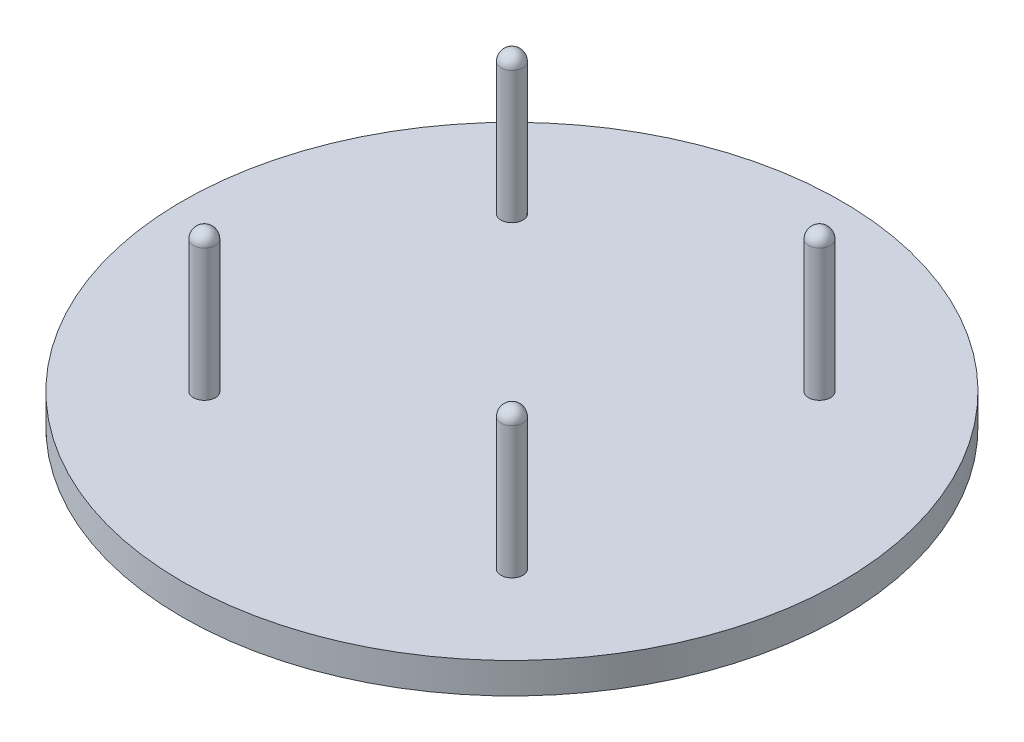
ISO-10303-21;
HEADER;
FILE_DESCRIPTION(('STEP AP214'),'2;1');
FILE_NAME('part.step','',(''),(''),'','','');
FILE_SCHEMA(('AUTOMOTIVE_DESIGN { 1 0 10303 214 1 1 1 1 }'));
ENDSEC;
DATA;
#1=APPLICATION_CONTEXT('core data for automotive mechanical design processes');
#2=APPLICATION_PROTOCOL_DEFINITION('international standard','automotive_design',2000,#1);
#3=PRODUCT_CONTEXT('',#1,'mechanical');
#4=PRODUCT('Part','Part','',(#3));
#5=PRODUCT_RELATED_PRODUCT_CATEGORY('part','',(#4));
#6=PRODUCT_DEFINITION_FORMATION('','',#4);
#7=PRODUCT_DEFINITION_CONTEXT('part definition',#1,'design');
#8=PRODUCT_DEFINITION('design','',#6,#7);
#9=PRODUCT_DEFINITION_SHAPE('','',#8);
#10=(LENGTH_UNIT() NAMED_UNIT(*) SI_UNIT(.MILLI.,.METRE.));
#11=(NAMED_UNIT(*) PLANE_ANGLE_UNIT() SI_UNIT($,.RADIAN.));
#12=(NAMED_UNIT(*) SI_UNIT($,.STERADIAN.) SOLID_ANGLE_UNIT());
#13=UNCERTAINTY_MEASURE_WITH_UNIT(LENGTH_MEASURE(1.E-05),#10,'distance_accuracy_value','');
#14=(GEOMETRIC_REPRESENTATION_CONTEXT(3) GLOBAL_UNCERTAINTY_ASSIGNED_CONTEXT((#13)) GLOBAL_UNIT_ASSIGNED_CONTEXT((#10,
#11,#12)) REPRESENTATION_CONTEXT('',''));
#15=CARTESIAN_POINT('',(0.,0.,0.));
#16=DIRECTION('',(0.,0.,1.));
#17=DIRECTION('',(1.,0.,0.));
#18=AXIS2_PLACEMENT_3D('',#15,#16,#17);
#19=CARTESIAN_POINT('',(0.,7.,0.));
#20=DIRECTION('',(0.,-1.,0.));
#21=DIRECTION('',(0.,0.,-1.));
#22=AXIS2_PLACEMENT_3D('',#19,#20,#21);
#23=CYLINDRICAL_SURFACE('',#22,75.);
#24=CARTESIAN_POINT('',(0.,7.,0.));
#25=DIRECTION('',(0.,1.,0.));
#26=DIRECTION('',(0.,0.,1.));
#27=AXIS2_PLACEMENT_3D('',#24,#25,#26);
#28=CIRCLE('',#27,75.);
#29=CARTESIAN_POINT('',(0.,7.,75.));
#30=VERTEX_POINT('',#29);
#31=EDGE_CURVE('E10',#30,#30,#28,.T.);
#32=ORIENTED_EDGE('',*,*,#31,.F.);
#33=EDGE_LOOP('',(#32));
#34=FACE_BOUND('',#33,.T.);
#35=CARTESIAN_POINT('',(0.,0.,0.));
#36=DIRECTION('',(0.,1.,0.));
#37=DIRECTION('',(0.,0.,1.));
#38=AXIS2_PLACEMENT_3D('',#35,#36,#37);
#39=CIRCLE('',#38,75.);
#40=CARTESIAN_POINT('',(0.,0.,75.));
#41=VERTEX_POINT('',#40);
#42=EDGE_CURVE('E52',#41,#41,#39,.T.);
#43=ORIENTED_EDGE('',*,*,#42,.T.);
#44=EDGE_LOOP('',(#43));
#45=FACE_BOUND('',#44,.T.);
#46=ADVANCED_FACE('F43',(#34,#45),#23,.T.);
#47=CARTESIAN_POINT('',(0.,7.,0.));
#48=DIRECTION('',(0.,1.,0.));
#49=DIRECTION('',(0.,0.,1.));
#50=AXIS2_PLACEMENT_3D('',#47,#48,#49);
#51=PLANE('',#50);
#52=CARTESIAN_POINT('',(35.0000000000004,7.,34.999999999999));
#53=DIRECTION('',(0.,1.,0.));
#54=DIRECTION('',(-1.,0.,0.));
#55=AXIS2_PLACEMENT_3D('',#52,#53,#54);
#56=CIRCLE('',#55,2.5);
#57=CARTESIAN_POINT('',(32.5000000000004,7.,34.999999999999));
#58=VERTEX_POINT('',#57);
#59=EDGE_CURVE('E86',#58,#58,#56,.T.);
#60=ORIENTED_EDGE('',*,*,#59,.F.);
#61=EDGE_LOOP('',(#60));
#62=FACE_BOUND('',#61,.T.);
#63=CARTESIAN_POINT('',(-34.9999999999994,7.,35.));
#64=DIRECTION('',(0.,1.,0.));
#65=DIRECTION('',(0.,0.,-1.));
#66=AXIS2_PLACEMENT_3D('',#63,#64,#65);
#67=CIRCLE('',#66,2.5);
#68=CARTESIAN_POINT('',(-34.9999999999994,7.,32.5));
#69=VERTEX_POINT('',#68);
#70=EDGE_CURVE('E74',#69,#69,#67,.T.);
#71=ORIENTED_EDGE('',*,*,#70,.F.);
#72=EDGE_LOOP('',(#71));
#73=FACE_BOUND('',#72,.T.);
#74=CARTESIAN_POINT('',(-35.0000000000001,7.,-34.9999999999992));
#75=DIRECTION('',(0.,1.,0.));
#76=DIRECTION('',(1.,0.,0.));
#77=AXIS2_PLACEMENT_3D('',#74,#75,#76);
#78=CIRCLE('',#77,2.5);
#79=CARTESIAN_POINT('',(-32.5000000000001,7.,-34.9999999999992));
#80=VERTEX_POINT('',#79);
#81=EDGE_CURVE('E70',#80,#80,#78,.T.);
#82=ORIENTED_EDGE('',*,*,#81,.F.);
#83=EDGE_LOOP('',(#82));
#84=FACE_BOUND('',#83,.T.);
#85=CARTESIAN_POINT('',(34.9999999999994,7.,-35.));
#86=DIRECTION('',(0.,1.,0.));
#87=DIRECTION('',(0.,0.,1.));
#88=AXIS2_PLACEMENT_3D('',#85,#86,#87);
#89=CIRCLE('',#88,2.5);
#90=CARTESIAN_POINT('',(34.9999999999994,7.,-32.5));
#91=VERTEX_POINT('',#90);
#92=EDGE_CURVE('E61',#91,#91,#89,.T.);
#93=ORIENTED_EDGE('',*,*,#92,.F.);
#94=EDGE_LOOP('',(#93));
#95=FACE_BOUND('',#94,.T.);
#96=ORIENTED_EDGE('',*,*,#31,.T.);
#97=EDGE_LOOP('',(#96));
#98=FACE_BOUND('',#97,.T.);
#99=ADVANCED_FACE('F94',(#62,#73,#84,#95,#98),#51,.T.);
#100=CARTESIAN_POINT('',(0.,0.,0.));
#101=DIRECTION('',(0.,1.,0.));
#102=DIRECTION('',(0.,0.,1.));
#103=AXIS2_PLACEMENT_3D('',#100,#101,#102);
#104=PLANE('',#103);
#105=ORIENTED_EDGE('',*,*,#42,.F.);
#106=EDGE_LOOP('',(#105));
#107=FACE_BOUND('',#106,.T.);
#108=ADVANCED_FACE('F97',(#107),#104,.F.);
#109=CARTESIAN_POINT('',(34.9999999999994,37.,-35.));
#110=DIRECTION('',(0.,-1.,0.));
#111=DIRECTION('',(0.,0.,-1.));
#112=AXIS2_PLACEMENT_3D('',#109,#110,#111);
#113=CYLINDRICAL_SURFACE('',#112,2.5);
#114=CARTESIAN_POINT('',(34.9999999999994,37.,-35.));
#115=DIRECTION('',(0.,1.,0.));
#116=DIRECTION('',(0.,0.,1.));
#117=AXIS2_PLACEMENT_3D('',#114,#115,#116);
#118=CIRCLE('',#117,2.5);
#119=CARTESIAN_POINT('',(34.9999999999994,37.,-32.5));
#120=VERTEX_POINT('',#119);
#121=EDGE_CURVE('E58',#120,#120,#118,.T.);
#122=ORIENTED_EDGE('',*,*,#121,.F.);
#123=EDGE_LOOP('',(#122));
#124=FACE_BOUND('',#123,.T.);
#125=ORIENTED_EDGE('',*,*,#92,.T.);
#126=EDGE_LOOP('',(#125));
#127=FACE_BOUND('',#126,.T.);
#128=ADVANCED_FACE('F106',(#124,#127),#113,.T.);
#129=CARTESIAN_POINT('',(34.9999999999994,37.,-35.));
#130=DIRECTION('',(0.,0.,1.));
#131=DIRECTION('',(1.,0.,0.));
#132=AXIS2_PLACEMENT_3D('',#129,#130,#131);
#133=SPHERICAL_SURFACE('',#132,2.5);
#134=CARTESIAN_POINT('',(34.9999999999994,37.,-35.));
#135=DIRECTION('',(0.,1.,0.));
#136=DIRECTION('',(0.,0.,1.));
#137=AXIS2_PLACEMENT_3D('',#134,#135,#136);
#138=SPHERICAL_SURFACE('',#137,2.5);
#139=ORIENTED_EDGE('',*,*,#121,.T.);
#140=EDGE_LOOP('',(#139));
#141=FACE_BOUND('',#140,.T.);
#142=ADVANCED_FACE('F108',(#141),#138,.T.);
#143=CARTESIAN_POINT('',(-35.0000000000001,37.,-34.9999999999992));
#144=DIRECTION('',(0.,-1.,0.));
#145=DIRECTION('',(0.,0.,-1.));
#146=AXIS2_PLACEMENT_3D('',#143,#144,#145);
#147=CYLINDRICAL_SURFACE('',#146,2.5);
#148=CARTESIAN_POINT('',(-35.0000000000001,37.,-34.9999999999992));
#149=DIRECTION('',(0.,1.,0.));
#150=DIRECTION('',(1.,0.,0.));
#151=AXIS2_PLACEMENT_3D('',#148,#149,#150);
#152=CIRCLE('',#151,2.5);
#153=CARTESIAN_POINT('',(-32.5000000000001,37.,-34.9999999999992));
#154=VERTEX_POINT('',#153);
#155=EDGE_CURVE('E67',#154,#154,#152,.T.);
#156=ORIENTED_EDGE('',*,*,#155,.F.);
#157=EDGE_LOOP('',(#156));
#158=FACE_BOUND('',#157,.T.);
#159=ORIENTED_EDGE('',*,*,#81,.T.);
#160=EDGE_LOOP('',(#159));
#161=FACE_BOUND('',#160,.T.);
#162=ADVANCED_FACE('F115',(#158,#161),#147,.T.);
#163=CARTESIAN_POINT('',(-35.0000000000001,37.,-34.9999999999992));
#164=DIRECTION('',(0.,0.,1.));
#165=DIRECTION('',(1.,0.,0.));
#166=AXIS2_PLACEMENT_3D('',#163,#164,#165);
#167=SPHERICAL_SURFACE('',#166,2.5);
#168=CARTESIAN_POINT('',(-35.0000000000001,37.,-34.9999999999992));
#169=DIRECTION('',(0.,1.,0.));
#170=DIRECTION('',(1.,0.,0.));
#171=AXIS2_PLACEMENT_3D('',#168,#169,#170);
#172=SPHERICAL_SURFACE('',#171,2.5);
#173=ORIENTED_EDGE('',*,*,#155,.T.);
#174=EDGE_LOOP('',(#173));
#175=FACE_BOUND('',#174,.T.);
#176=ADVANCED_FACE('F129',(#175),#172,.T.);
#177=CARTESIAN_POINT('',(-34.9999999999994,37.,35.));
#178=DIRECTION('',(0.,-1.,0.));
#179=DIRECTION('',(0.,0.,-1.));
#180=AXIS2_PLACEMENT_3D('',#177,#178,#179);
#181=CYLINDRICAL_SURFACE('',#180,2.5);
#182=CARTESIAN_POINT('',(-34.9999999999994,37.,35.));
#183=DIRECTION('',(0.,1.,0.));
#184=DIRECTION('',(0.,0.,-1.));
#185=AXIS2_PLACEMENT_3D('',#182,#183,#184);
#186=CIRCLE('',#185,2.5);
#187=CARTESIAN_POINT('',(-34.9999999999994,37.,32.5));
#188=VERTEX_POINT('',#187);
#189=EDGE_CURVE('E71',#188,#188,#186,.T.);
#190=ORIENTED_EDGE('',*,*,#189,.F.);
#191=EDGE_LOOP('',(#190));
#192=FACE_BOUND('',#191,.T.);
#193=ORIENTED_EDGE('',*,*,#70,.T.);
#194=EDGE_LOOP('',(#193));
#195=FACE_BOUND('',#194,.T.);
#196=ADVANCED_FACE('F131',(#192,#195),#181,.T.);
#197=CARTESIAN_POINT('',(-34.9999999999994,37.,35.));
#198=DIRECTION('',(0.,0.,1.));
#199=DIRECTION('',(1.,0.,0.));
#200=AXIS2_PLACEMENT_3D('',#197,#198,#199);
#201=SPHERICAL_SURFACE('',#200,2.5);
#202=CARTESIAN_POINT('',(-34.9999999999994,37.,35.));
#203=DIRECTION('',(0.,1.,0.));
#204=DIRECTION('',(0.,0.,-1.));
#205=AXIS2_PLACEMENT_3D('',#202,#203,#204);
#206=SPHERICAL_SURFACE('',#205,2.5);
#207=ORIENTED_EDGE('',*,*,#189,.T.);
#208=EDGE_LOOP('',(#207));
#209=FACE_BOUND('',#208,.T.);
#210=ADVANCED_FACE('F133',(#209),#206,.T.);
#211=CARTESIAN_POINT('',(35.0000000000004,37.,34.999999999999));
#212=DIRECTION('',(0.,-1.,0.));
#213=DIRECTION('',(0.,0.,-1.));
#214=AXIS2_PLACEMENT_3D('',#211,#212,#213);
#215=CYLINDRICAL_SURFACE('',#214,2.5);
#216=CARTESIAN_POINT('',(35.0000000000004,37.,34.999999999999));
#217=DIRECTION('',(0.,1.,0.));
#218=DIRECTION('',(-1.,0.,0.));
#219=AXIS2_PLACEMENT_3D('',#216,#217,#218);
#220=CIRCLE('',#219,2.5);
#221=CARTESIAN_POINT('',(32.5000000000004,37.,34.999999999999));
#222=VERTEX_POINT('',#221);
#223=EDGE_CURVE('E47',#222,#222,#220,.T.);
#224=ORIENTED_EDGE('',*,*,#223,.F.);
#225=EDGE_LOOP('',(#224));
#226=FACE_BOUND('',#225,.T.);
#227=ORIENTED_EDGE('',*,*,#59,.T.);
#228=EDGE_LOOP('',(#227));
#229=FACE_BOUND('',#228,.T.);
#230=ADVANCED_FACE('F92',(#226,#229),#215,.T.);
#231=CARTESIAN_POINT('',(35.0000000000004,37.,34.999999999999));
#232=DIRECTION('',(0.,0.,1.));
#233=DIRECTION('',(1.,0.,0.));
#234=AXIS2_PLACEMENT_3D('',#231,#232,#233);
#235=SPHERICAL_SURFACE('',#234,2.5);
#236=CARTESIAN_POINT('',(35.0000000000004,37.,34.999999999999));
#237=DIRECTION('',(0.,1.,0.));
#238=DIRECTION('',(-1.,0.,0.));
#239=AXIS2_PLACEMENT_3D('',#236,#237,#238);
#240=SPHERICAL_SURFACE('',#239,2.5);
#241=ORIENTED_EDGE('',*,*,#223,.T.);
#242=EDGE_LOOP('',(#241));
#243=FACE_BOUND('',#242,.T.);
#244=ADVANCED_FACE('F45',(#243),#240,.T.);
#245=CLOSED_SHELL('',(#46,#99,#108,#128,#142,#162,#176,#196,#210,#230,#244));
#246=MANIFOLD_SOLID_BREP('B2',#245);
#247=ADVANCED_BREP_SHAPE_REPRESENTATION('',(#18,#246),#14);
#248=SHAPE_DEFINITION_REPRESENTATION(#9,#247);
ENDSEC;
END-ISO-10303-21;
